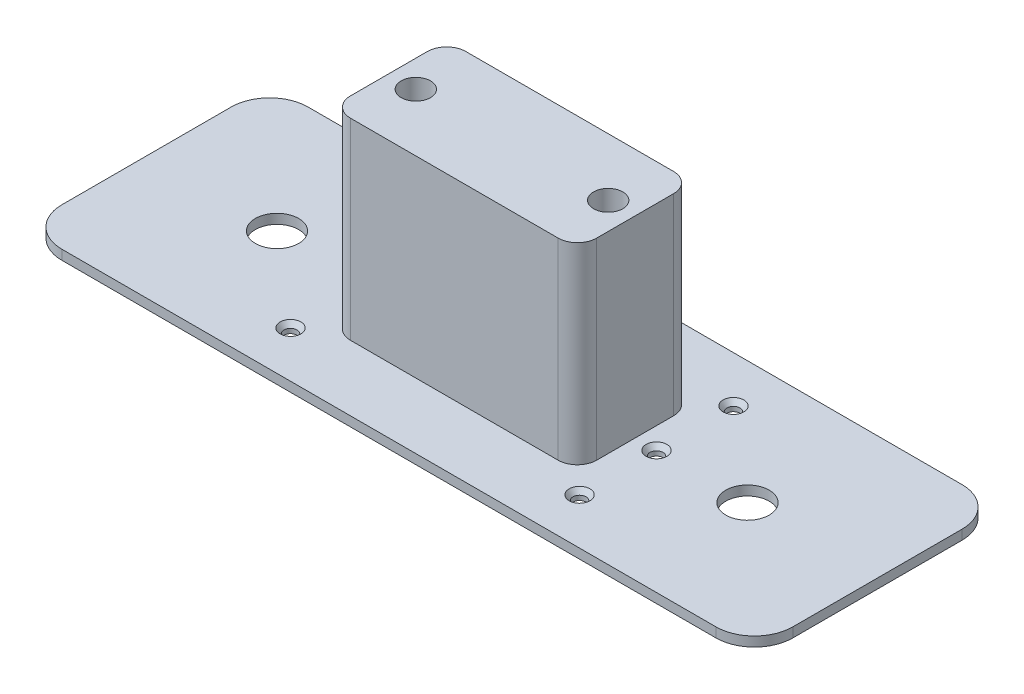
ISO-10303-21;
HEADER;
FILE_DESCRIPTION(('STEP AP214'),'2;1');
FILE_NAME('part.step','',(''),(''),'','','');
FILE_SCHEMA(('AUTOMOTIVE_DESIGN { 1 0 10303 214 1 1 1 1 }'));
ENDSEC;
DATA;
#1=APPLICATION_CONTEXT('core data for automotive mechanical design processes');
#2=APPLICATION_PROTOCOL_DEFINITION('international standard','automotive_design',2000,#1);
#3=PRODUCT_CONTEXT('',#1,'mechanical');
#4=PRODUCT('Part','Part','',(#3));
#5=PRODUCT_RELATED_PRODUCT_CATEGORY('part','',(#4));
#6=PRODUCT_DEFINITION_FORMATION('','',#4);
#7=PRODUCT_DEFINITION_CONTEXT('part definition',#1,'design');
#8=PRODUCT_DEFINITION('design','',#6,#7);
#9=PRODUCT_DEFINITION_SHAPE('','',#8);
#10=(LENGTH_UNIT() NAMED_UNIT(*) SI_UNIT(.MILLI.,.METRE.));
#11=(NAMED_UNIT(*) PLANE_ANGLE_UNIT() SI_UNIT($,.RADIAN.));
#12=(NAMED_UNIT(*) SI_UNIT($,.STERADIAN.) SOLID_ANGLE_UNIT());
#13=UNCERTAINTY_MEASURE_WITH_UNIT(LENGTH_MEASURE(1.E-05),#10,'distance_accuracy_value','');
#14=(GEOMETRIC_REPRESENTATION_CONTEXT(3) GLOBAL_UNCERTAINTY_ASSIGNED_CONTEXT((#13)) GLOBAL_UNIT_ASSIGNED_CONTEXT((#10,
#11,#12)) REPRESENTATION_CONTEXT('',''));
#15=CARTESIAN_POINT('',(0.,0.,0.));
#16=DIRECTION('',(0.,0.,1.));
#17=DIRECTION('',(1.,0.,0.));
#18=AXIS2_PLACEMENT_3D('',#15,#16,#17);
#19=CARTESIAN_POINT('',(60.325,1.5875,-20.32));
#20=DIRECTION('',(-1.,0.,0.));
#21=DIRECTION('',(0.,0.,1.));
#22=AXIS2_PLACEMENT_3D('',#19,#20,#21);
#23=PLANE('',#22);
#24=DIRECTION('',(0.,0.,-1.));
#25=VECTOR('',#24,1.);
#26=CARTESIAN_POINT('',(60.325,0.,-20.32));
#27=LINE('',#26,#25);
#28=CARTESIAN_POINT('',(60.325,0.,13.97));
#29=VERTEX_POINT('',#28);
#30=CARTESIAN_POINT('',(60.325,0.,-13.97));
#31=VERTEX_POINT('',#30);
#32=EDGE_CURVE('E204',#29,#31,#27,.T.);
#33=ORIENTED_EDGE('',*,*,#32,.T.);
#34=DIRECTION('',(0.,-1.,0.));
#35=VECTOR('',#34,1.);
#36=CARTESIAN_POINT('',(60.325,1.5875,-13.97));
#37=LINE('',#36,#35);
#38=CARTESIAN_POINT('',(60.325,1.5875,-13.97));
#39=VERTEX_POINT('',#38);
#40=EDGE_CURVE('E298',#31,#39,#37,.F.);
#41=ORIENTED_EDGE('',*,*,#40,.T.);
#42=DIRECTION('',(0.,0.,-1.));
#43=VECTOR('',#42,1.);
#44=CARTESIAN_POINT('',(60.325,1.5875,-20.32));
#45=LINE('',#44,#43);
#46=CARTESIAN_POINT('',(60.325,1.5875,13.97));
#47=VERTEX_POINT('',#46);
#48=EDGE_CURVE('E218',#47,#39,#45,.T.);
#49=ORIENTED_EDGE('',*,*,#48,.F.);
#50=DIRECTION('',(0.,-1.,0.));
#51=VECTOR('',#50,1.);
#52=CARTESIAN_POINT('',(60.325,1.5875,13.97));
#53=LINE('',#52,#51);
#54=EDGE_CURVE('E294',#47,#29,#53,.T.);
#55=ORIENTED_EDGE('',*,*,#54,.T.);
#56=EDGE_LOOP('',(#33,#41,#49,#55));
#57=FACE_BOUND('',#56,.T.);
#58=ADVANCED_FACE('F42',(#57),#23,.F.);
#59=CARTESIAN_POINT('',(-60.325,1.5875,-20.32));
#60=DIRECTION('',(0.,0.,1.));
#61=DIRECTION('',(1.,0.,0.));
#62=AXIS2_PLACEMENT_3D('',#59,#60,#61);
#63=PLANE('',#62);
#64=DIRECTION('',(-1.,0.,0.));
#65=VECTOR('',#64,1.);
#66=CARTESIAN_POINT('',(-60.325,0.,-20.32));
#67=LINE('',#66,#65);
#68=CARTESIAN_POINT('',(53.975,0.,-20.32));
#69=VERTEX_POINT('',#68);
#70=CARTESIAN_POINT('',(-53.975,0.,-20.32));
#71=VERTEX_POINT('',#70);
#72=EDGE_CURVE('E239',#69,#71,#67,.T.);
#73=ORIENTED_EDGE('',*,*,#72,.T.);
#74=DIRECTION('',(0.,-1.,0.));
#75=VECTOR('',#74,1.);
#76=CARTESIAN_POINT('',(-53.975,1.5875,-20.32));
#77=LINE('',#76,#75);
#78=CARTESIAN_POINT('',(-53.975,1.5875,-20.32));
#79=VERTEX_POINT('',#78);
#80=EDGE_CURVE('E291',#71,#79,#77,.F.);
#81=ORIENTED_EDGE('',*,*,#80,.T.);
#82=DIRECTION('',(-1.,0.,0.));
#83=VECTOR('',#82,1.);
#84=CARTESIAN_POINT('',(-60.325,1.5875,-20.32));
#85=LINE('',#84,#83);
#86=CARTESIAN_POINT('',(53.975,1.5875,-20.32));
#87=VERTEX_POINT('',#86);
#88=EDGE_CURVE('E222',#87,#79,#85,.T.);
#89=ORIENTED_EDGE('',*,*,#88,.F.);
#90=DIRECTION('',(0.,-1.,0.));
#91=VECTOR('',#90,1.);
#92=CARTESIAN_POINT('',(53.975,1.5875,-20.32));
#93=LINE('',#92,#91);
#94=EDGE_CURVE('E287',#87,#69,#93,.T.);
#95=ORIENTED_EDGE('',*,*,#94,.T.);
#96=EDGE_LOOP('',(#73,#81,#89,#95));
#97=FACE_BOUND('',#96,.T.);
#98=ADVANCED_FACE('F388',(#97),#63,.F.);
#99=CARTESIAN_POINT('',(-60.325,1.5875,-20.32));
#100=DIRECTION('',(1.,0.,0.));
#101=DIRECTION('',(0.,0.,-1.));
#102=AXIS2_PLACEMENT_3D('',#99,#100,#101);
#103=PLANE('',#102);
#104=DIRECTION('',(0.,0.,1.));
#105=VECTOR('',#104,1.);
#106=CARTESIAN_POINT('',(-60.325,0.,-20.32));
#107=LINE('',#106,#105);
#108=CARTESIAN_POINT('',(-60.325,0.,-13.97));
#109=VERTEX_POINT('',#108);
#110=CARTESIAN_POINT('',(-60.325,0.,13.97));
#111=VERTEX_POINT('',#110);
#112=EDGE_CURVE('E243',#109,#111,#107,.T.);
#113=ORIENTED_EDGE('',*,*,#112,.T.);
#114=DIRECTION('',(0.,-1.,0.));
#115=VECTOR('',#114,1.);
#116=CARTESIAN_POINT('',(-60.325,1.5875,13.97));
#117=LINE('',#116,#115);
#118=CARTESIAN_POINT('',(-60.325,1.5875,13.97));
#119=VERTEX_POINT('',#118);
#120=EDGE_CURVE('E272',#111,#119,#117,.F.);
#121=ORIENTED_EDGE('',*,*,#120,.T.);
#122=DIRECTION('',(0.,0.,1.));
#123=VECTOR('',#122,1.);
#124=CARTESIAN_POINT('',(-60.325,1.5875,-20.32));
#125=LINE('',#124,#123);
#126=CARTESIAN_POINT('',(-60.325,1.5875,-13.97));
#127=VERTEX_POINT('',#126);
#128=EDGE_CURVE('E227',#127,#119,#125,.T.);
#129=ORIENTED_EDGE('',*,*,#128,.F.);
#130=DIRECTION('',(0.,-1.,0.));
#131=VECTOR('',#130,1.);
#132=CARTESIAN_POINT('',(-60.325,1.5875,-13.97));
#133=LINE('',#132,#131);
#134=EDGE_CURVE('E268',#127,#109,#133,.T.);
#135=ORIENTED_EDGE('',*,*,#134,.T.);
#136=EDGE_LOOP('',(#113,#121,#129,#135));
#137=FACE_BOUND('',#136,.T.);
#138=ADVANCED_FACE('F394',(#137),#103,.F.);
#139=CARTESIAN_POINT('',(-60.325,1.5875,20.32));
#140=DIRECTION('',(0.,0.,-1.));
#141=DIRECTION('',(-1.,0.,0.));
#142=AXIS2_PLACEMENT_3D('',#139,#140,#141);
#143=PLANE('',#142);
#144=DIRECTION('',(1.,0.,0.));
#145=VECTOR('',#144,1.);
#146=CARTESIAN_POINT('',(-60.325,1.5875,20.32));
#147=LINE('',#146,#145);
#148=CARTESIAN_POINT('',(-53.975,1.5875,20.32));
#149=VERTEX_POINT('',#148);
#150=CARTESIAN_POINT('',(53.975,1.5875,20.32));
#151=VERTEX_POINT('',#150);
#152=EDGE_CURVE('E231',#149,#151,#147,.T.);
#153=ORIENTED_EDGE('',*,*,#152,.F.);
#154=DIRECTION('',(0.,-1.,0.));
#155=VECTOR('',#154,1.);
#156=CARTESIAN_POINT('',(-53.975,1.5875,20.32));
#157=LINE('',#156,#155);
#158=CARTESIAN_POINT('',(-53.975,0.,20.32));
#159=VERTEX_POINT('',#158);
#160=EDGE_CURVE('E252',#149,#159,#157,.T.);
#161=ORIENTED_EDGE('',*,*,#160,.T.);
#162=DIRECTION('',(1.,0.,0.));
#163=VECTOR('',#162,1.);
#164=CARTESIAN_POINT('',(-60.325,0.,20.32));
#165=LINE('',#164,#163);
#166=CARTESIAN_POINT('',(53.975,0.,20.32));
#167=VERTEX_POINT('',#166);
#168=EDGE_CURVE('E223',#159,#167,#165,.T.);
#169=ORIENTED_EDGE('',*,*,#168,.T.);
#170=DIRECTION('',(0.,-1.,0.));
#171=VECTOR('',#170,1.);
#172=CARTESIAN_POINT('',(53.975,1.5875,20.32));
#173=LINE('',#172,#171);
#174=EDGE_CURVE('E235',#167,#151,#173,.F.);
#175=ORIENTED_EDGE('',*,*,#174,.T.);
#176=EDGE_LOOP('',(#153,#161,#169,#175));
#177=FACE_BOUND('',#176,.T.);
#178=ADVANCED_FACE('F440',(#177),#143,.F.);
#179=CARTESIAN_POINT('',(0.,1.5875,0.));
#180=DIRECTION('',(0.,1.,0.));
#181=DIRECTION('',(0.,0.,1.));
#182=AXIS2_PLACEMENT_3D('',#179,#180,#181);
#183=PLANE('',#182);
#184=CARTESIAN_POINT('',(-38.825000074,1.5875,-0.0427927782781454));
#185=DIRECTION('',(0.,1.,0.));
#186=DIRECTION('',(0.,0.,1.));
#187=AXIS2_PLACEMENT_3D('',#184,#185,#186);
#188=CIRCLE('',#187,3.5749992);
#189=CARTESIAN_POINT('',(-38.825000074,1.5875,3.53220642172186));
#190=VERTEX_POINT('',#189);
#191=EDGE_CURVE('E816',#190,#190,#188,.T.);
#192=ORIENTED_EDGE('',*,*,#191,.F.);
#193=EDGE_LOOP('',(#192));
#194=FACE_BOUND('',#193,.T.);
#195=CARTESIAN_POINT('',(38.825000074,1.5875,-0.0427927782781454));
#196=DIRECTION('',(0.,1.,0.));
#197=DIRECTION('',(0.,0.,1.));
#198=AXIS2_PLACEMENT_3D('',#195,#196,#197);
#199=CIRCLE('',#198,3.5749992);
#200=CARTESIAN_POINT('',(38.825000074,1.5875,3.53220642172186));
#201=VERTEX_POINT('',#200);
#202=EDGE_CURVE('E819',#201,#201,#199,.T.);
#203=ORIENTED_EDGE('',*,*,#202,.F.);
#204=EDGE_LOOP('',(#203));
#205=FACE_BOUND('',#204,.T.);
#206=CARTESIAN_POINT('',(-23.850000074,1.5875,-12.7));
#207=DIRECTION('',(0.,1.,0.));
#208=DIRECTION('',(0.,0.,1.));
#209=AXIS2_PLACEMENT_3D('',#206,#207,#208);
#210=CIRCLE('',#209,1.7145);
#211=CARTESIAN_POINT('',(-23.850000074,1.5875,-10.9855));
#212=VERTEX_POINT('',#211);
#213=EDGE_CURVE('E812',#212,#212,#210,.T.);
#214=ORIENTED_EDGE('',*,*,#213,.F.);
#215=EDGE_LOOP('',(#214));
#216=FACE_BOUND('',#215,.T.);
#217=CARTESIAN_POINT('',(-23.850000074,1.5875,0.));
#218=DIRECTION('',(0.,1.,0.));
#219=DIRECTION('',(0.,0.,1.));
#220=AXIS2_PLACEMENT_3D('',#217,#218,#219);
#221=CIRCLE('',#220,1.7145);
#222=CARTESIAN_POINT('',(-23.850000074,1.5875,1.7145));
#223=VERTEX_POINT('',#222);
#224=EDGE_CURVE('E800',#223,#223,#221,.T.);
#225=ORIENTED_EDGE('',*,*,#224,.F.);
#226=EDGE_LOOP('',(#225));
#227=FACE_BOUND('',#226,.T.);
#228=CARTESIAN_POINT('',(-23.850000074,1.5875,12.7));
#229=DIRECTION('',(0.,1.,0.));
#230=DIRECTION('',(0.,0.,1.));
#231=AXIS2_PLACEMENT_3D('',#228,#229,#230);
#232=CIRCLE('',#231,1.7145);
#233=CARTESIAN_POINT('',(-23.850000074,1.5875,14.4145));
#234=VERTEX_POINT('',#233);
#235=EDGE_CURVE('E788',#234,#234,#232,.T.);
#236=ORIENTED_EDGE('',*,*,#235,.F.);
#237=EDGE_LOOP('',(#236));
#238=FACE_BOUND('',#237,.T.);
#239=CARTESIAN_POINT('',(23.850000074,1.5875,12.7));
#240=DIRECTION('',(0.,1.,0.));
#241=DIRECTION('',(0.,0.,1.));
#242=AXIS2_PLACEMENT_3D('',#239,#240,#241);
#243=CIRCLE('',#242,1.7145);
#244=CARTESIAN_POINT('',(23.850000074,1.5875,14.4145));
#245=VERTEX_POINT('',#244);
#246=EDGE_CURVE('E776',#245,#245,#243,.T.);
#247=ORIENTED_EDGE('',*,*,#246,.F.);
#248=EDGE_LOOP('',(#247));
#249=FACE_BOUND('',#248,.T.);
#250=CARTESIAN_POINT('',(23.850000074,1.5875,0.));
#251=DIRECTION('',(0.,1.,0.));
#252=DIRECTION('',(0.,0.,1.));
#253=AXIS2_PLACEMENT_3D('',#250,#251,#252);
#254=CIRCLE('',#253,1.7145);
#255=CARTESIAN_POINT('',(23.850000074,1.5875,1.7145));
#256=VERTEX_POINT('',#255);
#257=EDGE_CURVE('E764',#256,#256,#254,.T.);
#258=ORIENTED_EDGE('',*,*,#257,.F.);
#259=EDGE_LOOP('',(#258));
#260=FACE_BOUND('',#259,.T.);
#261=CARTESIAN_POINT('',(23.850000074,1.5875,-12.7));
#262=DIRECTION('',(0.,1.,0.));
#263=DIRECTION('',(0.,0.,1.));
#264=AXIS2_PLACEMENT_3D('',#261,#262,#263);
#265=CIRCLE('',#264,1.7145);
#266=CARTESIAN_POINT('',(23.850000074,1.5875,-10.9855));
#267=VERTEX_POINT('',#266);
#268=EDGE_CURVE('E749',#267,#267,#265,.T.);
#269=ORIENTED_EDGE('',*,*,#268,.F.);
#270=EDGE_LOOP('',(#269));
#271=FACE_BOUND('',#270,.T.);
#272=DIRECTION('',(0.,0.,-1.));
#273=VECTOR('',#272,1.);
#274=CARTESIAN_POINT('',(20.32,1.5875,-9.525));
#275=LINE('',#274,#273);
#276=CARTESIAN_POINT('',(20.32,1.5875,6.34999999999999));
#277=VERTEX_POINT('',#276);
#278=CARTESIAN_POINT('',(20.32,1.5875,-6.35));
#279=VERTEX_POINT('',#278);
#280=EDGE_CURVE('E186',#277,#279,#275,.T.);
#281=ORIENTED_EDGE('',*,*,#280,.F.);
#282=CARTESIAN_POINT('',(17.145,1.5875,6.35));
#283=DIRECTION('',(0.,1.,0.));
#284=DIRECTION('',(0.,0.,1.));
#285=AXIS2_PLACEMENT_3D('',#282,#283,#284);
#286=CIRCLE('',#285,3.175);
#287=CARTESIAN_POINT('',(17.145,1.5875,9.525));
#288=VERTEX_POINT('',#287);
#289=EDGE_CURVE('E51',#277,#288,#286,.F.);
#290=ORIENTED_EDGE('',*,*,#289,.T.);
#291=DIRECTION('',(1.,0.,0.));
#292=VECTOR('',#291,1.);
#293=CARTESIAN_POINT('',(-20.32,1.5875,9.525));
#294=LINE('',#293,#292);
#295=CARTESIAN_POINT('',(-17.145,1.5875,9.525));
#296=VERTEX_POINT('',#295);
#297=EDGE_CURVE('E192',#296,#288,#294,.T.);
#298=ORIENTED_EDGE('',*,*,#297,.F.);
#299=CARTESIAN_POINT('',(-17.145,1.5875,6.35));
#300=DIRECTION('',(0.,1.,0.));
#301=DIRECTION('',(0.,0.,1.));
#302=AXIS2_PLACEMENT_3D('',#299,#300,#301);
#303=CIRCLE('',#302,3.175);
#304=CARTESIAN_POINT('',(-20.32,1.5875,6.34999999999999));
#305=VERTEX_POINT('',#304);
#306=EDGE_CURVE('E343',#296,#305,#303,.F.);
#307=ORIENTED_EDGE('',*,*,#306,.T.);
#308=DIRECTION('',(0.,0.,1.));
#309=VECTOR('',#308,1.);
#310=CARTESIAN_POINT('',(-20.32,1.5875,-9.525));
#311=LINE('',#310,#309);
#312=CARTESIAN_POINT('',(-20.32,1.5875,-6.35));
#313=VERTEX_POINT('',#312);
#314=EDGE_CURVE('E211',#313,#305,#311,.T.);
#315=ORIENTED_EDGE('',*,*,#314,.F.);
#316=CARTESIAN_POINT('',(-17.145,1.5875,-6.35));
#317=DIRECTION('',(0.,1.,0.));
#318=DIRECTION('',(0.,0.,1.));
#319=AXIS2_PLACEMENT_3D('',#316,#317,#318);
#320=CIRCLE('',#319,3.175);
#321=CARTESIAN_POINT('',(-17.145,1.5875,-9.525));
#322=VERTEX_POINT('',#321);
#323=EDGE_CURVE('E340',#313,#322,#320,.F.);
#324=ORIENTED_EDGE('',*,*,#323,.T.);
#325=DIRECTION('',(-1.,0.,0.));
#326=VECTOR('',#325,1.);
#327=CARTESIAN_POINT('',(-20.32,1.5875,-9.525));
#328=LINE('',#327,#326);
#329=CARTESIAN_POINT('',(17.145,1.5875,-9.525));
#330=VERTEX_POINT('',#329);
#331=EDGE_CURVE('E207',#330,#322,#328,.T.);
#332=ORIENTED_EDGE('',*,*,#331,.F.);
#333=CARTESIAN_POINT('',(17.145,1.5875,-6.35));
#334=DIRECTION('',(0.,1.,0.));
#335=DIRECTION('',(0.,0.,1.));
#336=AXIS2_PLACEMENT_3D('',#333,#334,#335);
#337=CIRCLE('',#336,3.175);
#338=EDGE_CURVE('E11',#330,#279,#337,.F.);
#339=ORIENTED_EDGE('',*,*,#338,.T.);
#340=EDGE_LOOP('',(#281,#290,#298,#307,#315,#324,#332,#339));
#341=FACE_BOUND('',#340,.T.);
#342=ORIENTED_EDGE('',*,*,#128,.T.);
#343=CARTESIAN_POINT('',(-53.975,1.5875,13.97));
#344=DIRECTION('',(0.,1.,0.));
#345=DIRECTION('',(0.,0.,1.));
#346=AXIS2_PLACEMENT_3D('',#343,#344,#345);
#347=CIRCLE('',#346,6.35);
#348=EDGE_CURVE('E284',#119,#149,#347,.T.);
#349=ORIENTED_EDGE('',*,*,#348,.T.);
#350=ORIENTED_EDGE('',*,*,#152,.T.);
#351=CARTESIAN_POINT('',(53.975,1.5875,13.97));
#352=DIRECTION('',(0.,1.,0.));
#353=DIRECTION('',(0.,0.,1.));
#354=AXIS2_PLACEMENT_3D('',#351,#352,#353);
#355=CIRCLE('',#354,6.35);
#356=EDGE_CURVE('E275',#151,#47,#355,.T.);
#357=ORIENTED_EDGE('',*,*,#356,.T.);
#358=ORIENTED_EDGE('',*,*,#48,.T.);
#359=CARTESIAN_POINT('',(53.975,1.5875,-13.97));
#360=DIRECTION('',(0.,1.,0.));
#361=DIRECTION('',(0.,0.,1.));
#362=AXIS2_PLACEMENT_3D('',#359,#360,#361);
#363=CIRCLE('',#362,6.35);
#364=EDGE_CURVE('E278',#39,#87,#363,.T.);
#365=ORIENTED_EDGE('',*,*,#364,.T.);
#366=ORIENTED_EDGE('',*,*,#88,.T.);
#367=CARTESIAN_POINT('',(-53.975,1.5875,-13.97));
#368=DIRECTION('',(0.,1.,0.));
#369=DIRECTION('',(0.,0.,1.));
#370=AXIS2_PLACEMENT_3D('',#367,#368,#369);
#371=CIRCLE('',#370,6.35);
#372=EDGE_CURVE('E281',#79,#127,#371,.T.);
#373=ORIENTED_EDGE('',*,*,#372,.T.);
#374=EDGE_LOOP('',(#342,#349,#350,#357,#358,#365,#366,#373));
#375=FACE_BOUND('',#374,.T.);
#376=ADVANCED_FACE('F347',(#194,#205,#216,#227,#238,#249,#260,#271,#341,#375),#183,.T.);
#377=CARTESIAN_POINT('',(0.,0.,0.));
#378=DIRECTION('',(0.,1.,0.));
#379=DIRECTION('',(0.,0.,1.));
#380=AXIS2_PLACEMENT_3D('',#377,#378,#379);
#381=PLANE('',#380);
#382=CARTESIAN_POINT('',(-38.825000074,0.,-0.0427927782781454));
#383=DIRECTION('',(0.,-1.,0.));
#384=DIRECTION('',(0.,0.,-1.));
#385=AXIS2_PLACEMENT_3D('',#382,#383,#384);
#386=CIRCLE('',#385,3.5749992);
#387=CARTESIAN_POINT('',(-38.825000074,0.,-3.61779197827815));
#388=VERTEX_POINT('',#387);
#389=EDGE_CURVE('E823',#388,#388,#386,.T.);
#390=ORIENTED_EDGE('',*,*,#389,.F.);
#391=EDGE_LOOP('',(#390));
#392=FACE_BOUND('',#391,.T.);
#393=CARTESIAN_POINT('',(38.825000074,0.,-0.0427927782781454));
#394=DIRECTION('',(0.,-1.,0.));
#395=DIRECTION('',(0.,0.,1.));
#396=AXIS2_PLACEMENT_3D('',#393,#394,#395);
#397=CIRCLE('',#396,3.5749992);
#398=CARTESIAN_POINT('',(38.825000074,0.,3.53220642172186));
#399=VERTEX_POINT('',#398);
#400=EDGE_CURVE('E824',#399,#399,#397,.T.);
#401=ORIENTED_EDGE('',*,*,#400,.F.);
#402=EDGE_LOOP('',(#401));
#403=FACE_BOUND('',#402,.T.);
#404=CARTESIAN_POINT('',(-23.850000074,0.,-12.7));
#405=DIRECTION('',(0.,1.,0.));
#406=DIRECTION('',(0.,0.,1.));
#407=AXIS2_PLACEMENT_3D('',#404,#405,#406);
#408=CIRCLE('',#407,1.0795);
#409=CARTESIAN_POINT('',(-23.850000074,0.,-11.6205));
#410=VERTEX_POINT('',#409);
#411=EDGE_CURVE('E804',#410,#410,#408,.T.);
#412=ORIENTED_EDGE('',*,*,#411,.T.);
#413=EDGE_LOOP('',(#412));
#414=FACE_BOUND('',#413,.T.);
#415=CARTESIAN_POINT('',(-23.850000074,0.,0.));
#416=DIRECTION('',(0.,1.,0.));
#417=DIRECTION('',(0.,0.,1.));
#418=AXIS2_PLACEMENT_3D('',#415,#416,#417);
#419=CIRCLE('',#418,1.0795);
#420=CARTESIAN_POINT('',(-23.850000074,0.,1.0795));
#421=VERTEX_POINT('',#420);
#422=EDGE_CURVE('E792',#421,#421,#419,.T.);
#423=ORIENTED_EDGE('',*,*,#422,.T.);
#424=EDGE_LOOP('',(#423));
#425=FACE_BOUND('',#424,.T.);
#426=CARTESIAN_POINT('',(-23.850000074,0.,12.7));
#427=DIRECTION('',(0.,1.,0.));
#428=DIRECTION('',(0.,0.,1.));
#429=AXIS2_PLACEMENT_3D('',#426,#427,#428);
#430=CIRCLE('',#429,1.0795);
#431=CARTESIAN_POINT('',(-23.850000074,0.,13.7795));
#432=VERTEX_POINT('',#431);
#433=EDGE_CURVE('E780',#432,#432,#430,.T.);
#434=ORIENTED_EDGE('',*,*,#433,.T.);
#435=EDGE_LOOP('',(#434));
#436=FACE_BOUND('',#435,.T.);
#437=CARTESIAN_POINT('',(23.850000074,0.,12.7));
#438=DIRECTION('',(0.,1.,0.));
#439=DIRECTION('',(0.,0.,1.));
#440=AXIS2_PLACEMENT_3D('',#437,#438,#439);
#441=CIRCLE('',#440,1.0795);
#442=CARTESIAN_POINT('',(23.850000074,0.,13.7795));
#443=VERTEX_POINT('',#442);
#444=EDGE_CURVE('E768',#443,#443,#441,.T.);
#445=ORIENTED_EDGE('',*,*,#444,.T.);
#446=EDGE_LOOP('',(#445));
#447=FACE_BOUND('',#446,.T.);
#448=CARTESIAN_POINT('',(23.850000074,0.,0.));
#449=DIRECTION('',(0.,1.,0.));
#450=DIRECTION('',(0.,0.,1.));
#451=AXIS2_PLACEMENT_3D('',#448,#449,#450);
#452=CIRCLE('',#451,1.0795);
#453=CARTESIAN_POINT('',(23.850000074,0.,1.0795));
#454=VERTEX_POINT('',#453);
#455=EDGE_CURVE('E754',#454,#454,#452,.T.);
#456=ORIENTED_EDGE('',*,*,#455,.T.);
#457=EDGE_LOOP('',(#456));
#458=FACE_BOUND('',#457,.T.);
#459=CARTESIAN_POINT('',(23.850000074,0.,-12.7));
#460=DIRECTION('',(0.,1.,0.));
#461=DIRECTION('',(0.,0.,1.));
#462=AXIS2_PLACEMENT_3D('',#459,#460,#461);
#463=CIRCLE('',#462,1.0795);
#464=CARTESIAN_POINT('',(23.850000074,0.,-11.6205));
#465=VERTEX_POINT('',#464);
#466=EDGE_CURVE('E179',#465,#465,#463,.T.);
#467=ORIENTED_EDGE('',*,*,#466,.T.);
#468=EDGE_LOOP('',(#467));
#469=FACE_BOUND('',#468,.T.);
#470=ORIENTED_EDGE('',*,*,#168,.F.);
#471=CARTESIAN_POINT('',(-53.975,0.,13.97));
#472=DIRECTION('',(0.,1.,0.));
#473=DIRECTION('',(0.,0.,1.));
#474=AXIS2_PLACEMENT_3D('',#471,#472,#473);
#475=CIRCLE('',#474,6.35);
#476=EDGE_CURVE('E265',#159,#111,#475,.F.);
#477=ORIENTED_EDGE('',*,*,#476,.T.);
#478=ORIENTED_EDGE('',*,*,#112,.F.);
#479=CARTESIAN_POINT('',(-53.975,0.,-13.97));
#480=DIRECTION('',(0.,1.,0.));
#481=DIRECTION('',(0.,0.,1.));
#482=AXIS2_PLACEMENT_3D('',#479,#480,#481);
#483=CIRCLE('',#482,6.35);
#484=EDGE_CURVE('E262',#109,#71,#483,.F.);
#485=ORIENTED_EDGE('',*,*,#484,.T.);
#486=ORIENTED_EDGE('',*,*,#72,.F.);
#487=CARTESIAN_POINT('',(53.975,0.,-13.97));
#488=DIRECTION('',(0.,1.,0.));
#489=DIRECTION('',(0.,0.,1.));
#490=AXIS2_PLACEMENT_3D('',#487,#488,#489);
#491=CIRCLE('',#490,6.35);
#492=EDGE_CURVE('E259',#69,#31,#491,.F.);
#493=ORIENTED_EDGE('',*,*,#492,.T.);
#494=ORIENTED_EDGE('',*,*,#32,.F.);
#495=CARTESIAN_POINT('',(53.975,0.,13.97));
#496=DIRECTION('',(0.,1.,0.));
#497=DIRECTION('',(0.,0.,1.));
#498=AXIS2_PLACEMENT_3D('',#495,#496,#497);
#499=CIRCLE('',#498,6.35);
#500=EDGE_CURVE('E256',#29,#167,#499,.F.);
#501=ORIENTED_EDGE('',*,*,#500,.T.);
#502=EDGE_LOOP('',(#470,#477,#478,#485,#486,#493,#494,#501));
#503=FACE_BOUND('',#502,.T.);
#504=ADVANCED_FACE('F403',(#392,#403,#414,#425,#436,#447,#458,#469,#503),#381,.F.);
#505=CARTESIAN_POINT('',(-53.975,1.5875,13.97));
#506=DIRECTION('',(0.,-1.,0.));
#507=DIRECTION('',(0.,0.,-1.));
#508=AXIS2_PLACEMENT_3D('',#505,#506,#507);
#509=CYLINDRICAL_SURFACE('',#508,6.35);
#510=ORIENTED_EDGE('',*,*,#348,.F.);
#511=ORIENTED_EDGE('',*,*,#120,.F.);
#512=ORIENTED_EDGE('',*,*,#476,.F.);
#513=ORIENTED_EDGE('',*,*,#160,.F.);
#514=EDGE_LOOP('',(#510,#511,#512,#513));
#515=FACE_BOUND('',#514,.T.);
#516=ADVANCED_FACE('F399',(#515),#509,.T.);
#517=CARTESIAN_POINT('',(-53.975,1.5875,-13.97));
#518=DIRECTION('',(0.,-1.,0.));
#519=DIRECTION('',(0.,0.,-1.));
#520=AXIS2_PLACEMENT_3D('',#517,#518,#519);
#521=CYLINDRICAL_SURFACE('',#520,6.35);
#522=ORIENTED_EDGE('',*,*,#372,.F.);
#523=ORIENTED_EDGE('',*,*,#80,.F.);
#524=ORIENTED_EDGE('',*,*,#484,.F.);
#525=ORIENTED_EDGE('',*,*,#134,.F.);
#526=EDGE_LOOP('',(#522,#523,#524,#525));
#527=FACE_BOUND('',#526,.T.);
#528=ADVANCED_FACE('F402',(#527),#521,.T.);
#529=CARTESIAN_POINT('',(53.975,1.5875,-13.97));
#530=DIRECTION('',(0.,-1.,0.));
#531=DIRECTION('',(0.,0.,-1.));
#532=AXIS2_PLACEMENT_3D('',#529,#530,#531);
#533=CYLINDRICAL_SURFACE('',#532,6.35);
#534=ORIENTED_EDGE('',*,*,#364,.F.);
#535=ORIENTED_EDGE('',*,*,#40,.F.);
#536=ORIENTED_EDGE('',*,*,#492,.F.);
#537=ORIENTED_EDGE('',*,*,#94,.F.);
#538=EDGE_LOOP('',(#534,#535,#536,#537));
#539=FACE_BOUND('',#538,.T.);
#540=ADVANCED_FACE('F407',(#539),#533,.T.);
#541=CARTESIAN_POINT('',(53.975,1.5875,13.97));
#542=DIRECTION('',(0.,-1.,0.));
#543=DIRECTION('',(0.,0.,-1.));
#544=AXIS2_PLACEMENT_3D('',#541,#542,#543);
#545=CYLINDRICAL_SURFACE('',#544,6.35);
#546=ORIENTED_EDGE('',*,*,#356,.F.);
#547=ORIENTED_EDGE('',*,*,#174,.F.);
#548=ORIENTED_EDGE('',*,*,#500,.F.);
#549=ORIENTED_EDGE('',*,*,#54,.F.);
#550=EDGE_LOOP('',(#546,#547,#548,#549));
#551=FACE_BOUND('',#550,.T.);
#552=ADVANCED_FACE('F411',(#551),#545,.T.);
#553=CARTESIAN_POINT('',(20.32,33.3375,-9.525));
#554=DIRECTION('',(-1.,0.,0.));
#555=DIRECTION('',(0.,0.,1.));
#556=AXIS2_PLACEMENT_3D('',#553,#554,#555);
#557=PLANE('',#556);
#558=DIRECTION('',(0.,0.,-1.));
#559=VECTOR('',#558,1.);
#560=CARTESIAN_POINT('',(20.32,33.3375,-9.525));
#561=LINE('',#560,#559);
#562=CARTESIAN_POINT('',(20.32,33.3375,6.34999999999999));
#563=VERTEX_POINT('',#562);
#564=CARTESIAN_POINT('',(20.32,33.3375,-6.35));
#565=VERTEX_POINT('',#564);
#566=EDGE_CURVE('E187',#563,#565,#561,.T.);
#567=ORIENTED_EDGE('',*,*,#566,.F.);
#568=DIRECTION('',(0.,-1.,0.));
#569=VECTOR('',#568,1.);
#570=CARTESIAN_POINT('',(20.32,33.3375,6.35));
#571=LINE('',#570,#569);
#572=EDGE_CURVE('E337',#563,#277,#571,.T.);
#573=ORIENTED_EDGE('',*,*,#572,.T.);
#574=ORIENTED_EDGE('',*,*,#280,.T.);
#575=DIRECTION('',(0.,-1.,0.));
#576=VECTOR('',#575,1.);
#577=CARTESIAN_POINT('',(20.32,33.3375,-6.35));
#578=LINE('',#577,#576);
#579=EDGE_CURVE('E334',#279,#565,#578,.F.);
#580=ORIENTED_EDGE('',*,*,#579,.T.);
#581=EDGE_LOOP('',(#567,#573,#574,#580));
#582=FACE_BOUND('',#581,.T.);
#583=ADVANCED_FACE('F360',(#582),#557,.F.);
#584=CARTESIAN_POINT('',(-20.32,33.3375,-9.525));
#585=DIRECTION('',(0.,0.,1.));
#586=DIRECTION('',(1.,0.,0.));
#587=AXIS2_PLACEMENT_3D('',#584,#585,#586);
#588=PLANE('',#587);
#589=ORIENTED_EDGE('',*,*,#331,.T.);
#590=DIRECTION('',(0.,-1.,0.));
#591=VECTOR('',#590,1.);
#592=CARTESIAN_POINT('',(-17.145,33.3375,-9.525));
#593=LINE('',#592,#591);
#594=CARTESIAN_POINT('',(-17.145,33.3375,-9.525));
#595=VERTEX_POINT('',#594);
#596=EDGE_CURVE('E312',#322,#595,#593,.F.);
#597=ORIENTED_EDGE('',*,*,#596,.T.);
#598=DIRECTION('',(-1.,0.,0.));
#599=VECTOR('',#598,1.);
#600=CARTESIAN_POINT('',(-20.32,33.3375,-9.525));
#601=LINE('',#600,#599);
#602=CARTESIAN_POINT('',(17.145,33.3375,-9.525));
#603=VERTEX_POINT('',#602);
#604=EDGE_CURVE('E191',#603,#595,#601,.T.);
#605=ORIENTED_EDGE('',*,*,#604,.F.);
#606=DIRECTION('',(0.,-1.,0.));
#607=VECTOR('',#606,1.);
#608=CARTESIAN_POINT('',(17.145,33.3375,-9.525));
#609=LINE('',#608,#607);
#610=EDGE_CURVE('E308',#603,#330,#609,.T.);
#611=ORIENTED_EDGE('',*,*,#610,.T.);
#612=EDGE_LOOP('',(#589,#597,#605,#611));
#613=FACE_BOUND('',#612,.T.);
#614=ADVANCED_FACE('F367',(#613),#588,.F.);
#615=CARTESIAN_POINT('',(-20.32,33.3375,-9.525));
#616=DIRECTION('',(1.,0.,0.));
#617=DIRECTION('',(0.,0.,-1.));
#618=AXIS2_PLACEMENT_3D('',#615,#616,#617);
#619=PLANE('',#618);
#620=DIRECTION('',(0.,0.,1.));
#621=VECTOR('',#620,1.);
#622=CARTESIAN_POINT('',(-20.32,33.3375,-9.525));
#623=LINE('',#622,#621);
#624=CARTESIAN_POINT('',(-20.32,33.3375,-6.35));
#625=VERTEX_POINT('',#624);
#626=CARTESIAN_POINT('',(-20.32,33.3375,6.34999999999999));
#627=VERTEX_POINT('',#626);
#628=EDGE_CURVE('E196',#625,#627,#623,.T.);
#629=ORIENTED_EDGE('',*,*,#628,.F.);
#630=DIRECTION('',(0.,-1.,0.));
#631=VECTOR('',#630,1.);
#632=CARTESIAN_POINT('',(-20.32,33.3375,-6.35));
#633=LINE('',#632,#631);
#634=EDGE_CURVE('E304',#625,#313,#633,.T.);
#635=ORIENTED_EDGE('',*,*,#634,.T.);
#636=ORIENTED_EDGE('',*,*,#314,.T.);
#637=DIRECTION('',(0.,-1.,0.));
#638=VECTOR('',#637,1.);
#639=CARTESIAN_POINT('',(-20.32,33.3375,6.35));
#640=LINE('',#639,#638);
#641=EDGE_CURVE('E301',#305,#627,#640,.F.);
#642=ORIENTED_EDGE('',*,*,#641,.T.);
#643=EDGE_LOOP('',(#629,#635,#636,#642));
#644=FACE_BOUND('',#643,.T.);
#645=ADVANCED_FACE('F375',(#644),#619,.F.);
#646=CARTESIAN_POINT('',(-20.32,33.3375,9.525));
#647=DIRECTION('',(0.,0.,-1.));
#648=DIRECTION('',(-1.,0.,0.));
#649=AXIS2_PLACEMENT_3D('',#646,#647,#648);
#650=PLANE('',#649);
#651=DIRECTION('',(1.,0.,0.));
#652=VECTOR('',#651,1.);
#653=CARTESIAN_POINT('',(-20.32,33.3375,9.525));
#654=LINE('',#653,#652);
#655=CARTESIAN_POINT('',(-17.145,33.3375,9.525));
#656=VERTEX_POINT('',#655);
#657=CARTESIAN_POINT('',(17.145,33.3375,9.525));
#658=VERTEX_POINT('',#657);
#659=EDGE_CURVE('E200',#656,#658,#654,.T.);
#660=ORIENTED_EDGE('',*,*,#659,.F.);
#661=DIRECTION('',(0.,-1.,0.));
#662=VECTOR('',#661,1.);
#663=CARTESIAN_POINT('',(-17.145,33.3375,9.525));
#664=LINE('',#663,#662);
#665=EDGE_CURVE('E330',#656,#296,#664,.T.);
#666=ORIENTED_EDGE('',*,*,#665,.T.);
#667=ORIENTED_EDGE('',*,*,#297,.T.);
#668=DIRECTION('',(0.,-1.,0.));
#669=VECTOR('',#668,1.);
#670=CARTESIAN_POINT('',(17.145,33.3375,9.525));
#671=LINE('',#670,#669);
#672=EDGE_CURVE('E327',#288,#658,#671,.F.);
#673=ORIENTED_EDGE('',*,*,#672,.T.);
#674=EDGE_LOOP('',(#660,#666,#667,#673));
#675=FACE_BOUND('',#674,.T.);
#676=ADVANCED_FACE('F351',(#675),#650,.F.);
#677=CARTESIAN_POINT('',(0.,33.3375,0.));
#678=DIRECTION('',(0.,1.,0.));
#679=DIRECTION('',(0.,0.,1.));
#680=AXIS2_PLACEMENT_3D('',#677,#678,#679);
#681=PLANE('',#680);
#682=CARTESIAN_POINT('',(-15.875,33.3375,0.));
#683=DIRECTION('',(0.,1.,0.));
#684=DIRECTION('',(0.,0.,1.));
#685=AXIS2_PLACEMENT_3D('',#682,#683,#684);
#686=CIRCLE('',#685,2.41299999999999);
#687=CARTESIAN_POINT('',(-15.875,33.3375,2.41299999999999));
#688=VERTEX_POINT('',#687);
#689=EDGE_CURVE('E171',#688,#688,#686,.T.);
#690=ORIENTED_EDGE('',*,*,#689,.F.);
#691=EDGE_LOOP('',(#690));
#692=FACE_BOUND('',#691,.T.);
#693=CARTESIAN_POINT('',(15.875,33.3375,0.));
#694=DIRECTION('',(0.,1.,0.));
#695=DIRECTION('',(0.,0.,1.));
#696=AXIS2_PLACEMENT_3D('',#693,#694,#695);
#697=CIRCLE('',#696,2.41299999999999);
#698=CARTESIAN_POINT('',(15.875,33.3375,2.41299999999999));
#699=VERTEX_POINT('',#698);
#700=EDGE_CURVE('E170',#699,#699,#697,.T.);
#701=ORIENTED_EDGE('',*,*,#700,.F.);
#702=EDGE_LOOP('',(#701));
#703=FACE_BOUND('',#702,.T.);
#704=ORIENTED_EDGE('',*,*,#604,.T.);
#705=CARTESIAN_POINT('',(-17.145,33.3375,-6.35));
#706=DIRECTION('',(0.,1.,0.));
#707=DIRECTION('',(0.,0.,1.));
#708=AXIS2_PLACEMENT_3D('',#705,#706,#707);
#709=CIRCLE('',#708,3.175);
#710=EDGE_CURVE('E324',#595,#625,#709,.T.);
#711=ORIENTED_EDGE('',*,*,#710,.T.);
#712=ORIENTED_EDGE('',*,*,#628,.T.);
#713=CARTESIAN_POINT('',(-17.145,33.3375,6.35));
#714=DIRECTION('',(0.,1.,0.));
#715=DIRECTION('',(0.,0.,1.));
#716=AXIS2_PLACEMENT_3D('',#713,#714,#715);
#717=CIRCLE('',#716,3.175);
#718=EDGE_CURVE('E321',#627,#656,#717,.T.);
#719=ORIENTED_EDGE('',*,*,#718,.T.);
#720=ORIENTED_EDGE('',*,*,#659,.T.);
#721=CARTESIAN_POINT('',(17.145,33.3375,6.35));
#722=DIRECTION('',(0.,1.,0.));
#723=DIRECTION('',(0.,0.,1.));
#724=AXIS2_PLACEMENT_3D('',#721,#722,#723);
#725=CIRCLE('',#724,3.175);
#726=EDGE_CURVE('E318',#658,#563,#725,.T.);
#727=ORIENTED_EDGE('',*,*,#726,.T.);
#728=ORIENTED_EDGE('',*,*,#566,.T.);
#729=CARTESIAN_POINT('',(17.145,33.3375,-6.35));
#730=DIRECTION('',(0.,1.,0.));
#731=DIRECTION('',(0.,0.,1.));
#732=AXIS2_PLACEMENT_3D('',#729,#730,#731);
#733=CIRCLE('',#732,3.175);
#734=EDGE_CURVE('E315',#565,#603,#733,.T.);
#735=ORIENTED_EDGE('',*,*,#734,.T.);
#736=EDGE_LOOP('',(#704,#711,#712,#719,#720,#727,#728,#735));
#737=FACE_BOUND('',#736,.T.);
#738=ADVANCED_FACE('F357',(#692,#703,#737),#681,.T.);
#739=CARTESIAN_POINT('',(-17.145,33.3375,-6.35));
#740=DIRECTION('',(0.,-1.,0.));
#741=DIRECTION('',(0.,0.,-1.));
#742=AXIS2_PLACEMENT_3D('',#739,#740,#741);
#743=CYLINDRICAL_SURFACE('',#742,3.175);
#744=ORIENTED_EDGE('',*,*,#710,.F.);
#745=ORIENTED_EDGE('',*,*,#596,.F.);
#746=ORIENTED_EDGE('',*,*,#323,.F.);
#747=ORIENTED_EDGE('',*,*,#634,.F.);
#748=EDGE_LOOP('',(#744,#745,#746,#747));
#749=FACE_BOUND('',#748,.T.);
#750=ADVANCED_FACE('F370',(#749),#743,.T.);
#751=CARTESIAN_POINT('',(-17.145,33.3375,6.35));
#752=DIRECTION('',(0.,-1.,0.));
#753=DIRECTION('',(0.,0.,-1.));
#754=AXIS2_PLACEMENT_3D('',#751,#752,#753);
#755=CYLINDRICAL_SURFACE('',#754,3.175);
#756=ORIENTED_EDGE('',*,*,#718,.F.);
#757=ORIENTED_EDGE('',*,*,#641,.F.);
#758=ORIENTED_EDGE('',*,*,#306,.F.);
#759=ORIENTED_EDGE('',*,*,#665,.F.);
#760=EDGE_LOOP('',(#756,#757,#758,#759));
#761=FACE_BOUND('',#760,.T.);
#762=ADVANCED_FACE('F379',(#761),#755,.T.);
#763=CARTESIAN_POINT('',(17.145,33.3375,6.35));
#764=DIRECTION('',(0.,-1.,0.));
#765=DIRECTION('',(0.,0.,-1.));
#766=AXIS2_PLACEMENT_3D('',#763,#764,#765);
#767=CYLINDRICAL_SURFACE('',#766,3.175);
#768=ORIENTED_EDGE('',*,*,#726,.F.);
#769=ORIENTED_EDGE('',*,*,#672,.F.);
#770=ORIENTED_EDGE('',*,*,#289,.F.);
#771=ORIENTED_EDGE('',*,*,#572,.F.);
#772=EDGE_LOOP('',(#768,#769,#770,#771));
#773=FACE_BOUND('',#772,.T.);
#774=ADVANCED_FACE('F354',(#773),#767,.T.);
#775=CARTESIAN_POINT('',(17.145,33.3375,-6.35));
#776=DIRECTION('',(0.,-1.,0.));
#777=DIRECTION('',(0.,0.,-1.));
#778=AXIS2_PLACEMENT_3D('',#775,#776,#777);
#779=CYLINDRICAL_SURFACE('',#778,3.175);
#780=ORIENTED_EDGE('',*,*,#734,.F.);
#781=ORIENTED_EDGE('',*,*,#579,.F.);
#782=ORIENTED_EDGE('',*,*,#338,.F.);
#783=ORIENTED_EDGE('',*,*,#610,.F.);
#784=EDGE_LOOP('',(#780,#781,#782,#783));
#785=FACE_BOUND('',#784,.T.);
#786=ADVANCED_FACE('F44',(#785),#779,.T.);
#787=CARTESIAN_POINT('',(15.875,7.9375,0.));
#788=DIRECTION('',(0.,1.,0.));
#789=DIRECTION('',(0.,0.,1.));
#790=AXIS2_PLACEMENT_3D('',#787,#788,#789);
#791=CONICAL_SURFACE('',#790,2.41299999999999,1.02974425867665);
#792=CARTESIAN_POINT('',(15.875,6.4876233262865,0.));
#793=VERTEX_POINT('',#792);
#794=VERTEX_LOOP('',#793);
#795=FACE_BOUND('',#794,.T.);
#796=CARTESIAN_POINT('',(15.875,7.9375,0.));
#797=DIRECTION('',(0.,1.,0.));
#798=DIRECTION('',(0.,0.,1.));
#799=AXIS2_PLACEMENT_3D('',#796,#797,#798);
#800=CIRCLE('',#799,2.41299999999999);
#801=CARTESIAN_POINT('',(15.875,7.9375,2.41299999999999));
#802=VERTEX_POINT('',#801);
#803=EDGE_CURVE('E176',#802,#802,#800,.T.);
#804=ORIENTED_EDGE('',*,*,#803,.T.);
#805=EDGE_LOOP('',(#804));
#806=FACE_BOUND('',#805,.T.);
#807=ADVANCED_FACE('F557',(#795,#806),#791,.F.);
#808=CARTESIAN_POINT('',(15.875,33.3375,0.));
#809=DIRECTION('',(0.,1.,0.));
#810=DIRECTION('',(0.,0.,1.));
#811=AXIS2_PLACEMENT_3D('',#808,#809,#810);
#812=CYLINDRICAL_SURFACE('',#811,2.41299999999999);
#813=ORIENTED_EDGE('',*,*,#803,.F.);
#814=EDGE_LOOP('',(#813));
#815=FACE_BOUND('',#814,.T.);
#816=ORIENTED_EDGE('',*,*,#700,.T.);
#817=EDGE_LOOP('',(#816));
#818=FACE_BOUND('',#817,.T.);
#819=ADVANCED_FACE('F163',(#815,#818),#812,.F.);
#820=CARTESIAN_POINT('',(-15.875,7.9375,0.));
#821=DIRECTION('',(0.,1.,0.));
#822=DIRECTION('',(0.,0.,1.));
#823=AXIS2_PLACEMENT_3D('',#820,#821,#822);
#824=CONICAL_SURFACE('',#823,2.41299999999999,1.02974425867665);
#825=CARTESIAN_POINT('',(-15.875,6.4876233262865,0.));
#826=VERTEX_POINT('',#825);
#827=VERTEX_LOOP('',#826);
#828=FACE_BOUND('',#827,.T.);
#829=CARTESIAN_POINT('',(-15.875,7.9375,0.));
#830=DIRECTION('',(0.,1.,0.));
#831=DIRECTION('',(0.,0.,1.));
#832=AXIS2_PLACEMENT_3D('',#829,#830,#831);
#833=CIRCLE('',#832,2.41299999999999);
#834=CARTESIAN_POINT('',(-15.875,7.9375,2.41299999999999));
#835=VERTEX_POINT('',#834);
#836=EDGE_CURVE('E167',#835,#835,#833,.T.);
#837=ORIENTED_EDGE('',*,*,#836,.T.);
#838=EDGE_LOOP('',(#837));
#839=FACE_BOUND('',#838,.T.);
#840=ADVANCED_FACE('F159',(#828,#839),#824,.F.);
#841=CARTESIAN_POINT('',(-15.875,33.3375,0.));
#842=DIRECTION('',(0.,1.,0.));
#843=DIRECTION('',(0.,0.,1.));
#844=AXIS2_PLACEMENT_3D('',#841,#842,#843);
#845=CYLINDRICAL_SURFACE('',#844,2.41299999999999);
#846=ORIENTED_EDGE('',*,*,#836,.F.);
#847=EDGE_LOOP('',(#846));
#848=FACE_BOUND('',#847,.T.);
#849=ORIENTED_EDGE('',*,*,#689,.T.);
#850=EDGE_LOOP('',(#849));
#851=FACE_BOUND('',#850,.T.);
#852=ADVANCED_FACE('F162',(#848,#851),#845,.F.);
#853=CARTESIAN_POINT('',(23.850000074,1.5875,-12.7));
#854=DIRECTION('',(0.,1.,0.));
#855=DIRECTION('',(0.,0.,1.));
#856=AXIS2_PLACEMENT_3D('',#853,#854,#855);
#857=CYLINDRICAL_SURFACE('',#856,1.0795);
#858=ORIENTED_EDGE('',*,*,#466,.F.);
#859=EDGE_LOOP('',(#858));
#860=FACE_BOUND('',#859,.T.);
#861=CARTESIAN_POINT('',(23.850000074,0.759951888245835,-12.7));
#862=DIRECTION('',(0.,1.,0.));
#863=DIRECTION('',(0.,0.,1.));
#864=AXIS2_PLACEMENT_3D('',#861,#862,#863);
#865=CIRCLE('',#864,1.0795);
#866=CARTESIAN_POINT('',(23.850000074,0.759951888245835,-11.6205));
#867=VERTEX_POINT('',#866);
#868=EDGE_CURVE('E747',#867,#867,#865,.T.);
#869=ORIENTED_EDGE('',*,*,#868,.T.);
#870=EDGE_LOOP('',(#869));
#871=FACE_BOUND('',#870,.T.);
#872=ADVANCED_FACE('F548',(#860,#871),#857,.F.);
#873=CARTESIAN_POINT('',(23.850000074,1.5875,-12.7));
#874=DIRECTION('',(0.,1.,0.));
#875=DIRECTION('',(0.,0.,1.));
#876=AXIS2_PLACEMENT_3D('',#873,#874,#875);
#877=CONICAL_SURFACE('',#876,1.7145,0.654498469497873);
#878=ORIENTED_EDGE('',*,*,#868,.F.);
#879=EDGE_LOOP('',(#878));
#880=FACE_BOUND('',#879,.T.);
#881=ORIENTED_EDGE('',*,*,#268,.T.);
#882=EDGE_LOOP('',(#881));
#883=FACE_BOUND('',#882,.T.);
#884=ADVANCED_FACE('F544',(#880,#883),#877,.F.);
#885=CARTESIAN_POINT('',(23.850000074,1.5875,0.));
#886=DIRECTION('',(0.,1.,0.));
#887=DIRECTION('',(0.,0.,1.));
#888=AXIS2_PLACEMENT_3D('',#885,#886,#887);
#889=CYLINDRICAL_SURFACE('',#888,1.0795);
#890=ORIENTED_EDGE('',*,*,#455,.F.);
#891=EDGE_LOOP('',(#890));
#892=FACE_BOUND('',#891,.T.);
#893=CARTESIAN_POINT('',(23.850000074,0.759951888245835,0.));
#894=DIRECTION('',(0.,1.,0.));
#895=DIRECTION('',(0.,0.,1.));
#896=AXIS2_PLACEMENT_3D('',#893,#894,#895);
#897=CIRCLE('',#896,1.0795);
#898=CARTESIAN_POINT('',(23.850000074,0.759951888245835,1.0795));
#899=VERTEX_POINT('',#898);
#900=EDGE_CURVE('E760',#899,#899,#897,.T.);
#901=ORIENTED_EDGE('',*,*,#900,.T.);
#902=EDGE_LOOP('',(#901));
#903=FACE_BOUND('',#902,.T.);
#904=ADVANCED_FACE('F540',(#892,#903),#889,.F.);
#905=CARTESIAN_POINT('',(23.850000074,1.5875,0.));
#906=DIRECTION('',(0.,1.,0.));
#907=DIRECTION('',(0.,0.,1.));
#908=AXIS2_PLACEMENT_3D('',#905,#906,#907);
#909=CONICAL_SURFACE('',#908,1.7145,0.654498469497873);
#910=ORIENTED_EDGE('',*,*,#900,.F.);
#911=EDGE_LOOP('',(#910));
#912=FACE_BOUND('',#911,.T.);
#913=ORIENTED_EDGE('',*,*,#257,.T.);
#914=EDGE_LOOP('',(#913));
#915=FACE_BOUND('',#914,.T.);
#916=ADVANCED_FACE('F536',(#912,#915),#909,.F.);
#917=CARTESIAN_POINT('',(23.850000074,1.5875,12.7));
#918=DIRECTION('',(0.,1.,0.));
#919=DIRECTION('',(0.,0.,1.));
#920=AXIS2_PLACEMENT_3D('',#917,#918,#919);
#921=CYLINDRICAL_SURFACE('',#920,1.0795);
#922=ORIENTED_EDGE('',*,*,#444,.F.);
#923=EDGE_LOOP('',(#922));
#924=FACE_BOUND('',#923,.T.);
#925=CARTESIAN_POINT('',(23.850000074,0.759951888245835,12.7));
#926=DIRECTION('',(0.,1.,0.));
#927=DIRECTION('',(0.,0.,1.));
#928=AXIS2_PLACEMENT_3D('',#925,#926,#927);
#929=CIRCLE('',#928,1.0795);
#930=CARTESIAN_POINT('',(23.850000074,0.759951888245835,13.7795));
#931=VERTEX_POINT('',#930);
#932=EDGE_CURVE('E772',#931,#931,#929,.T.);
#933=ORIENTED_EDGE('',*,*,#932,.T.);
#934=EDGE_LOOP('',(#933));
#935=FACE_BOUND('',#934,.T.);
#936=ADVANCED_FACE('F532',(#924,#935),#921,.F.);
#937=CARTESIAN_POINT('',(23.850000074,1.5875,12.7));
#938=DIRECTION('',(0.,1.,0.));
#939=DIRECTION('',(0.,0.,1.));
#940=AXIS2_PLACEMENT_3D('',#937,#938,#939);
#941=CONICAL_SURFACE('',#940,1.7145,0.654498469497873);
#942=ORIENTED_EDGE('',*,*,#932,.F.);
#943=EDGE_LOOP('',(#942));
#944=FACE_BOUND('',#943,.T.);
#945=ORIENTED_EDGE('',*,*,#246,.T.);
#946=EDGE_LOOP('',(#945));
#947=FACE_BOUND('',#946,.T.);
#948=ADVANCED_FACE('F528',(#944,#947),#941,.F.);
#949=CARTESIAN_POINT('',(-23.850000074,1.5875,12.7));
#950=DIRECTION('',(0.,1.,0.));
#951=DIRECTION('',(0.,0.,1.));
#952=AXIS2_PLACEMENT_3D('',#949,#950,#951);
#953=CYLINDRICAL_SURFACE('',#952,1.0795);
#954=ORIENTED_EDGE('',*,*,#433,.F.);
#955=EDGE_LOOP('',(#954));
#956=FACE_BOUND('',#955,.T.);
#957=CARTESIAN_POINT('',(-23.850000074,0.759951888245835,12.7));
#958=DIRECTION('',(0.,1.,0.));
#959=DIRECTION('',(0.,0.,1.));
#960=AXIS2_PLACEMENT_3D('',#957,#958,#959);
#961=CIRCLE('',#960,1.0795);
#962=CARTESIAN_POINT('',(-23.850000074,0.759951888245835,13.7795));
#963=VERTEX_POINT('',#962);
#964=EDGE_CURVE('E784',#963,#963,#961,.T.);
#965=ORIENTED_EDGE('',*,*,#964,.T.);
#966=EDGE_LOOP('',(#965));
#967=FACE_BOUND('',#966,.T.);
#968=ADVANCED_FACE('F524',(#956,#967),#953,.F.);
#969=CARTESIAN_POINT('',(-23.850000074,1.5875,12.7));
#970=DIRECTION('',(0.,1.,0.));
#971=DIRECTION('',(0.,0.,1.));
#972=AXIS2_PLACEMENT_3D('',#969,#970,#971);
#973=CONICAL_SURFACE('',#972,1.7145,0.654498469497873);
#974=ORIENTED_EDGE('',*,*,#964,.F.);
#975=EDGE_LOOP('',(#974));
#976=FACE_BOUND('',#975,.T.);
#977=ORIENTED_EDGE('',*,*,#235,.T.);
#978=EDGE_LOOP('',(#977));
#979=FACE_BOUND('',#978,.T.);
#980=ADVANCED_FACE('F520',(#976,#979),#973,.F.);
#981=CARTESIAN_POINT('',(-23.850000074,1.5875,0.));
#982=DIRECTION('',(0.,1.,0.));
#983=DIRECTION('',(0.,0.,1.));
#984=AXIS2_PLACEMENT_3D('',#981,#982,#983);
#985=CYLINDRICAL_SURFACE('',#984,1.0795);
#986=ORIENTED_EDGE('',*,*,#422,.F.);
#987=EDGE_LOOP('',(#986));
#988=FACE_BOUND('',#987,.T.);
#989=CARTESIAN_POINT('',(-23.850000074,0.759951888245835,0.));
#990=DIRECTION('',(0.,1.,0.));
#991=DIRECTION('',(0.,0.,1.));
#992=AXIS2_PLACEMENT_3D('',#989,#990,#991);
#993=CIRCLE('',#992,1.0795);
#994=CARTESIAN_POINT('',(-23.850000074,0.759951888245835,1.0795));
#995=VERTEX_POINT('',#994);
#996=EDGE_CURVE('E796',#995,#995,#993,.T.);
#997=ORIENTED_EDGE('',*,*,#996,.T.);
#998=EDGE_LOOP('',(#997));
#999=FACE_BOUND('',#998,.T.);
#1000=ADVANCED_FACE('F516',(#988,#999),#985,.F.);
#1001=CARTESIAN_POINT('',(-23.850000074,1.5875,0.));
#1002=DIRECTION('',(0.,1.,0.));
#1003=DIRECTION('',(0.,0.,1.));
#1004=AXIS2_PLACEMENT_3D('',#1001,#1002,#1003);
#1005=CONICAL_SURFACE('',#1004,1.7145,0.654498469497873);
#1006=ORIENTED_EDGE('',*,*,#996,.F.);
#1007=EDGE_LOOP('',(#1006));
#1008=FACE_BOUND('',#1007,.T.);
#1009=ORIENTED_EDGE('',*,*,#224,.T.);
#1010=EDGE_LOOP('',(#1009));
#1011=FACE_BOUND('',#1010,.T.);
#1012=ADVANCED_FACE('F512',(#1008,#1011),#1005,.F.);
#1013=CARTESIAN_POINT('',(-23.850000074,1.5875,-12.7));
#1014=DIRECTION('',(0.,1.,0.));
#1015=DIRECTION('',(0.,0.,1.));
#1016=AXIS2_PLACEMENT_3D('',#1013,#1014,#1015);
#1017=CYLINDRICAL_SURFACE('',#1016,1.0795);
#1018=ORIENTED_EDGE('',*,*,#411,.F.);
#1019=EDGE_LOOP('',(#1018));
#1020=FACE_BOUND('',#1019,.T.);
#1021=CARTESIAN_POINT('',(-23.850000074,0.759951888245835,-12.7));
#1022=DIRECTION('',(0.,1.,0.));
#1023=DIRECTION('',(0.,0.,1.));
#1024=AXIS2_PLACEMENT_3D('',#1021,#1022,#1023);
#1025=CIRCLE('',#1024,1.0795);
#1026=CARTESIAN_POINT('',(-23.850000074,0.759951888245835,-11.6205));
#1027=VERTEX_POINT('',#1026);
#1028=EDGE_CURVE('E808',#1027,#1027,#1025,.T.);
#1029=ORIENTED_EDGE('',*,*,#1028,.T.);
#1030=EDGE_LOOP('',(#1029));
#1031=FACE_BOUND('',#1030,.T.);
#1032=ADVANCED_FACE('F508',(#1020,#1031),#1017,.F.);
#1033=CARTESIAN_POINT('',(-23.850000074,1.5875,-12.7));
#1034=DIRECTION('',(0.,1.,0.));
#1035=DIRECTION('',(0.,0.,1.));
#1036=AXIS2_PLACEMENT_3D('',#1033,#1034,#1035);
#1037=CONICAL_SURFACE('',#1036,1.7145,0.654498469497873);
#1038=ORIENTED_EDGE('',*,*,#1028,.F.);
#1039=EDGE_LOOP('',(#1038));
#1040=FACE_BOUND('',#1039,.T.);
#1041=ORIENTED_EDGE('',*,*,#213,.T.);
#1042=EDGE_LOOP('',(#1041));
#1043=FACE_BOUND('',#1042,.T.);
#1044=ADVANCED_FACE('F475',(#1040,#1043),#1037,.F.);
#1045=CARTESIAN_POINT('',(38.825000074,33.3375,-0.0427927782781454));
#1046=DIRECTION('',(0.,-1.,0.));
#1047=DIRECTION('',(0.,0.,-1.));
#1048=AXIS2_PLACEMENT_3D('',#1045,#1046,#1047);
#1049=CYLINDRICAL_SURFACE('',#1048,3.5749992);
#1050=ORIENTED_EDGE('',*,*,#202,.T.);
#1051=EDGE_LOOP('',(#1050));
#1052=FACE_BOUND('',#1051,.T.);
#1053=ORIENTED_EDGE('',*,*,#400,.T.);
#1054=EDGE_LOOP('',(#1053));
#1055=FACE_BOUND('',#1054,.T.);
#1056=ADVANCED_FACE('F485',(#1052,#1055),#1049,.F.);
#1057=CARTESIAN_POINT('',(-38.825000074,33.3375,-0.0427927782781454));
#1058=DIRECTION('',(0.,-1.,0.));
#1059=DIRECTION('',(0.,0.,-1.));
#1060=AXIS2_PLACEMENT_3D('',#1057,#1058,#1059);
#1061=CYLINDRICAL_SURFACE('',#1060,3.5749992);
#1062=ORIENTED_EDGE('',*,*,#191,.T.);
#1063=EDGE_LOOP('',(#1062));
#1064=FACE_BOUND('',#1063,.T.);
#1065=ORIENTED_EDGE('',*,*,#389,.T.);
#1066=EDGE_LOOP('',(#1065));
#1067=FACE_BOUND('',#1066,.T.);
#1068=ADVANCED_FACE('F490',(#1064,#1067),#1061,.F.);
#1069=CLOSED_SHELL('',(#58,#98,#138,#178,#376,#504,#516,#528,#540,#552,#583,#614,#645,#676,#738,
#750,#762,#774,#786,#807,#819,#840,#852,#872,#884,#904,#916,#936,#948,#968,#980,#1000,#1012,
#1032,#1044,#1056,#1068));
#1070=MANIFOLD_SOLID_BREP('B2',#1069);
#1071=ADVANCED_BREP_SHAPE_REPRESENTATION('',(#18,#1070),#14);
#1072=SHAPE_DEFINITION_REPRESENTATION(#9,#1071);
ENDSEC;
END-ISO-10303-21;
